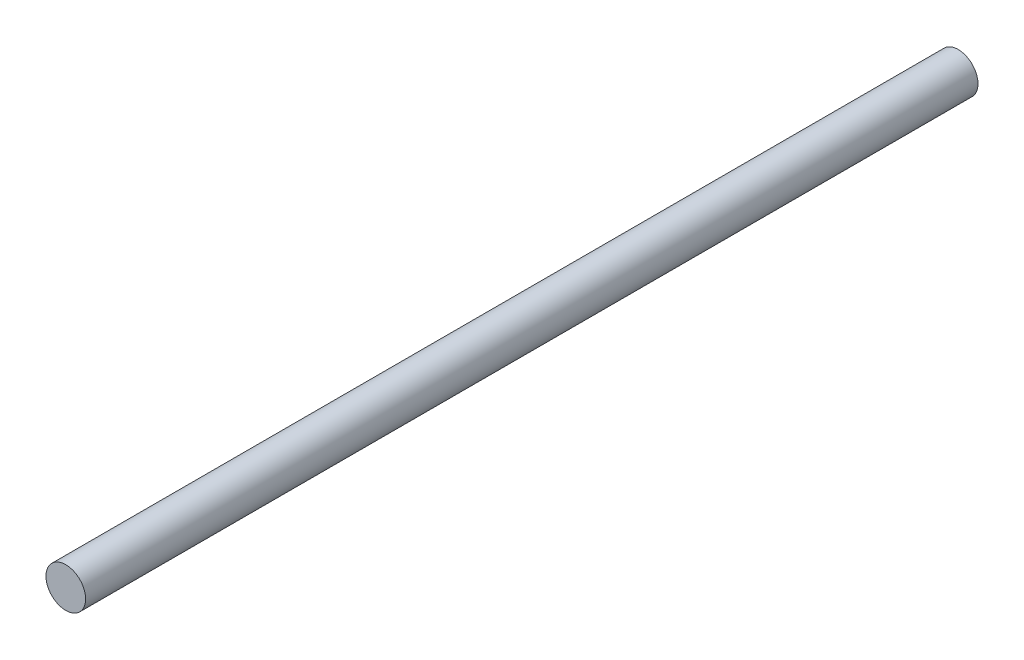
ISO-10303-21;
HEADER;
FILE_DESCRIPTION(('STEP AP214'),'2;1');
FILE_NAME('part.step','',(''),(''),'','','');
FILE_SCHEMA(('AUTOMOTIVE_DESIGN { 1 0 10303 214 1 1 1 1 }'));
ENDSEC;
DATA;
#1=APPLICATION_CONTEXT('core data for automotive mechanical design processes');
#2=APPLICATION_PROTOCOL_DEFINITION('international standard','automotive_design',2000,#1);
#3=PRODUCT_CONTEXT('',#1,'mechanical');
#4=PRODUCT('Part','Part','',(#3));
#5=PRODUCT_RELATED_PRODUCT_CATEGORY('part','',(#4));
#6=PRODUCT_DEFINITION_FORMATION('','',#4);
#7=PRODUCT_DEFINITION_CONTEXT('part definition',#1,'design');
#8=PRODUCT_DEFINITION('design','',#6,#7);
#9=PRODUCT_DEFINITION_SHAPE('','',#8);
#10=(LENGTH_UNIT() NAMED_UNIT(*) SI_UNIT(.MILLI.,.METRE.));
#11=(NAMED_UNIT(*) PLANE_ANGLE_UNIT() SI_UNIT($,.RADIAN.));
#12=(NAMED_UNIT(*) SI_UNIT($,.STERADIAN.) SOLID_ANGLE_UNIT());
#13=UNCERTAINTY_MEASURE_WITH_UNIT(LENGTH_MEASURE(1.E-05),#10,'distance_accuracy_value','');
#14=(GEOMETRIC_REPRESENTATION_CONTEXT(3) GLOBAL_UNCERTAINTY_ASSIGNED_CONTEXT((#13)) GLOBAL_UNIT_ASSIGNED_CONTEXT((#10,
#11,#12)) REPRESENTATION_CONTEXT('',''));
#15=CARTESIAN_POINT('',(0.,0.,0.));
#16=DIRECTION('',(0.,0.,1.));
#17=DIRECTION('',(1.,0.,0.));
#18=AXIS2_PLACEMENT_3D('',#15,#16,#17);
#19=CARTESIAN_POINT('',(0.,0.,1350.));
#20=DIRECTION('',(0.,0.,-1.));
#21=DIRECTION('',(-1.,0.,0.));
#22=AXIS2_PLACEMENT_3D('',#19,#20,#21);
#23=CYLINDRICAL_SURFACE('',#22,30.);
#24=CARTESIAN_POINT('',(0.,0.,1350.));
#25=DIRECTION('',(0.,0.,1.));
#26=DIRECTION('',(1.,0.,0.));
#27=AXIS2_PLACEMENT_3D('',#24,#25,#26);
#28=CIRCLE('',#27,30.);
#29=CARTESIAN_POINT('',(30.,0.,1350.));
#30=VERTEX_POINT('',#29);
#31=EDGE_CURVE('E10',#30,#30,#28,.T.);
#32=ORIENTED_EDGE('',*,*,#31,.F.);
#33=EDGE_LOOP('',(#32));
#34=FACE_BOUND('',#33,.T.);
#35=CARTESIAN_POINT('',(0.,0.,0.));
#36=DIRECTION('',(0.,0.,1.));
#37=DIRECTION('',(1.,0.,0.));
#38=AXIS2_PLACEMENT_3D('',#35,#36,#37);
#39=CIRCLE('',#38,30.);
#40=CARTESIAN_POINT('',(30.,0.,0.));
#41=VERTEX_POINT('',#40);
#42=EDGE_CURVE('E33',#41,#41,#39,.T.);
#43=ORIENTED_EDGE('',*,*,#42,.T.);
#44=EDGE_LOOP('',(#43));
#45=FACE_BOUND('',#44,.T.);
#46=ADVANCED_FACE('F30',(#34,#45),#23,.T.);
#47=CARTESIAN_POINT('',(0.,0.,1350.));
#48=DIRECTION('',(0.,0.,1.));
#49=DIRECTION('',(1.,0.,0.));
#50=AXIS2_PLACEMENT_3D('',#47,#48,#49);
#51=PLANE('',#50);
#52=ORIENTED_EDGE('',*,*,#31,.T.);
#53=EDGE_LOOP('',(#52));
#54=FACE_BOUND('',#53,.T.);
#55=ADVANCED_FACE('F45',(#54),#51,.T.);
#56=CARTESIAN_POINT('',(0.,0.,0.));
#57=DIRECTION('',(0.,0.,1.));
#58=DIRECTION('',(1.,0.,0.));
#59=AXIS2_PLACEMENT_3D('',#56,#57,#58);
#60=PLANE('',#59);
#61=ORIENTED_EDGE('',*,*,#42,.F.);
#62=EDGE_LOOP('',(#61));
#63=FACE_BOUND('',#62,.T.);
#64=ADVANCED_FACE('F43',(#63),#60,.F.);
#65=CLOSED_SHELL('',(#46,#55,#64));
#66=MANIFOLD_SOLID_BREP('B2',#65);
#67=ADVANCED_BREP_SHAPE_REPRESENTATION('',(#18,#66),#14);
#68=SHAPE_DEFINITION_REPRESENTATION(#9,#67);
ENDSEC;
END-ISO-10303-21;
